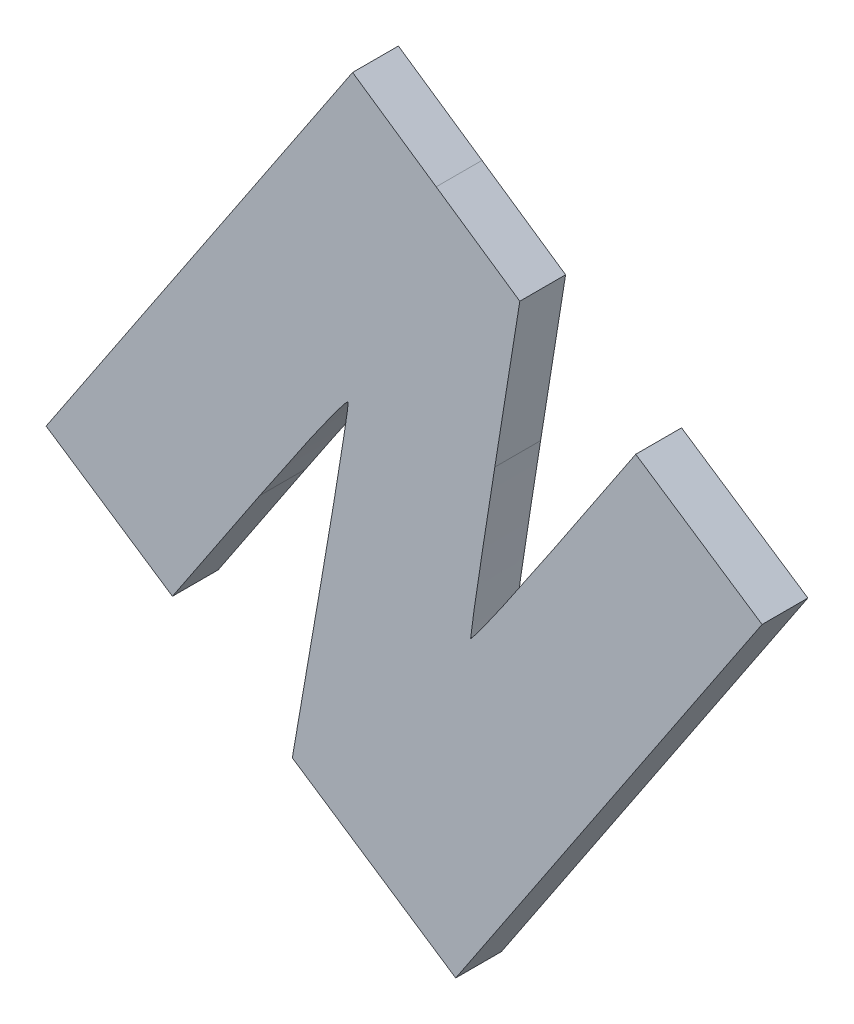
ISO-10303-21;
HEADER;
FILE_DESCRIPTION(('STEP AP214'),'2;1');
FILE_NAME('part.step','',(''),(''),'','','');
FILE_SCHEMA(('AUTOMOTIVE_DESIGN { 1 0 10303 214 1 1 1 1 }'));
ENDSEC;
DATA;
#1=APPLICATION_CONTEXT('core data for automotive mechanical design processes');
#2=APPLICATION_PROTOCOL_DEFINITION('international standard','automotive_design',2000,#1);
#3=PRODUCT_CONTEXT('',#1,'mechanical');
#4=PRODUCT('Part','Part','',(#3));
#5=PRODUCT_RELATED_PRODUCT_CATEGORY('part','',(#4));
#6=PRODUCT_DEFINITION_FORMATION('','',#4);
#7=PRODUCT_DEFINITION_CONTEXT('part definition',#1,'design');
#8=PRODUCT_DEFINITION('design','',#6,#7);
#9=PRODUCT_DEFINITION_SHAPE('','',#8);
#10=(LENGTH_UNIT() NAMED_UNIT(*) SI_UNIT(.MILLI.,.METRE.));
#11=(NAMED_UNIT(*) PLANE_ANGLE_UNIT() SI_UNIT($,.RADIAN.));
#12=(NAMED_UNIT(*) SI_UNIT($,.STERADIAN.) SOLID_ANGLE_UNIT());
#13=UNCERTAINTY_MEASURE_WITH_UNIT(LENGTH_MEASURE(1.E-05),#10,'distance_accuracy_value','');
#14=(GEOMETRIC_REPRESENTATION_CONTEXT(3) GLOBAL_UNCERTAINTY_ASSIGNED_CONTEXT((#13)) GLOBAL_UNIT_ASSIGNED_CONTEXT((#10,
#11,#12)) REPRESENTATION_CONTEXT('',''));
#15=CARTESIAN_POINT('',(0.,0.,0.));
#16=DIRECTION('',(0.,0.,1.));
#17=DIRECTION('',(1.,0.,0.));
#18=AXIS2_PLACEMENT_3D('',#15,#16,#17);
#19=CARTESIAN_POINT('',(-4.12792484346,-1.777454052987,0.));
#20=DIRECTION('',(0.564979802556376,0.825104734384283,0.));
#21=DIRECTION('',(-0.825104734384283,0.564979802556376,0.));
#22=AXIS2_PLACEMENT_3D('',#19,#20,#21);
#23=PLANE('',#22);
#24=DIRECTION('',(0.825104734384283,-0.564979802556376,0.));
#25=VECTOR('',#24,1.);
#26=CARTESIAN_POINT('',(-4.146180366013,-1.764953819868,0.));
#27=LINE('',#26,#25);
#28=CARTESIAN_POINT('',(-4.146180366013,-1.764953819868,0.));
#29=VERTEX_POINT('',#28);
#30=CARTESIAN_POINT('',(-4.12792484346,-1.777454052987,0.));
#31=VERTEX_POINT('',#30);
#32=EDGE_CURVE('E11',#29,#31,#27,.T.);
#33=ORIENTED_EDGE('',*,*,#32,.F.);
#34=DIRECTION('',(0.,0.,1.));
#35=VECTOR('',#34,1.);
#36=CARTESIAN_POINT('',(-4.146180366013,-1.764953819868,0.));
#37=LINE('',#36,#35);
#38=CARTESIAN_POINT('',(-4.146180366013,-1.764953819868,0.01));
#39=VERTEX_POINT('',#38);
#40=EDGE_CURVE('E24',#29,#39,#37,.T.);
#41=ORIENTED_EDGE('',*,*,#40,.T.);
#42=DIRECTION('',(-0.825104734384283,0.564979802556376,0.));
#43=VECTOR('',#42,1.);
#44=CARTESIAN_POINT('',(-4.146180366013,-1.764953819868,0.01));
#45=LINE('',#44,#43);
#46=CARTESIAN_POINT('',(-4.12792484346,-1.777454052987,0.01));
#47=VERTEX_POINT('',#46);
#48=EDGE_CURVE('E142',#47,#39,#45,.T.);
#49=ORIENTED_EDGE('',*,*,#48,.F.);
#50=DIRECTION('',(0.,0.,1.));
#51=VECTOR('',#50,1.);
#52=CARTESIAN_POINT('',(-4.12792484346,-1.777454052987,0.));
#53=LINE('',#52,#51);
#54=EDGE_CURVE('E326',#31,#47,#53,.T.);
#55=ORIENTED_EDGE('',*,*,#54,.F.);
#56=EDGE_LOOP('',(#33,#41,#49,#55));
#57=FACE_BOUND('',#56,.T.);
#58=ADVANCED_FACE('F17',(#57),#23,.T.);
#59=CARTESIAN_POINT('',(-4.109669329617,-1.789954299165,0.));
#60=DIRECTION('',(0.564980387914672,0.82510433356745,0.));
#61=DIRECTION('',(-0.82510433356745,0.564980387914672,0.));
#62=AXIS2_PLACEMENT_3D('',#59,#60,#61);
#63=PLANE('',#62);
#64=DIRECTION('',(0.825104333567451,-0.564980387914672,0.));
#65=VECTOR('',#64,1.);
#66=CARTESIAN_POINT('',(-4.12792484346,-1.777454052987,0.));
#67=LINE('',#66,#65);
#68=CARTESIAN_POINT('',(-4.109669329617,-1.789954299165,0.));
#69=VERTEX_POINT('',#68);
#70=EDGE_CURVE('E324',#31,#69,#67,.T.);
#71=ORIENTED_EDGE('',*,*,#70,.F.);
#72=ORIENTED_EDGE('',*,*,#54,.T.);
#73=DIRECTION('',(-0.825104333567451,0.564980387914672,0.));
#74=VECTOR('',#73,1.);
#75=CARTESIAN_POINT('',(-4.12792484346,-1.777454052987,0.01));
#76=LINE('',#75,#74);
#77=CARTESIAN_POINT('',(-4.109669329617,-1.789954299165,0.01));
#78=VERTEX_POINT('',#77);
#79=EDGE_CURVE('E322',#78,#47,#76,.T.);
#80=ORIENTED_EDGE('',*,*,#79,.F.);
#81=DIRECTION('',(0.,0.,1.));
#82=VECTOR('',#81,1.);
#83=CARTESIAN_POINT('',(-4.109669329617,-1.789954299165,0.));
#84=LINE('',#83,#82);
#85=EDGE_CURVE('E319',#69,#78,#84,.T.);
#86=ORIENTED_EDGE('',*,*,#85,.F.);
#87=EDGE_LOOP('',(#71,#72,#80,#86));
#88=FACE_BOUND('',#87,.T.);
#89=ADVANCED_FACE('F420',(#88),#63,.T.);
#90=CARTESIAN_POINT('',(-4.115127378726,-1.8240489952,0.));
#91=DIRECTION('',(0.987427536095057,-0.158072328259078,0.));
#92=DIRECTION('',(0.158072328259078,0.987427536095057,0.));
#93=AXIS2_PLACEMENT_3D('',#90,#91,#92);
#94=PLANE('',#93);
#95=DIRECTION('',(-0.158072328259078,-0.987427536095057,0.));
#96=VECTOR('',#95,1.);
#97=CARTESIAN_POINT('',(-4.109669329617,-1.789954299165,0.));
#98=LINE('',#97,#96);
#99=CARTESIAN_POINT('',(-4.115127378726,-1.8240489952,0.));
#100=VERTEX_POINT('',#99);
#101=EDGE_CURVE('E317',#69,#100,#98,.T.);
#102=ORIENTED_EDGE('',*,*,#101,.F.);
#103=ORIENTED_EDGE('',*,*,#85,.T.);
#104=DIRECTION('',(0.158072328259078,0.987427536095057,0.));
#105=VECTOR('',#104,1.);
#106=CARTESIAN_POINT('',(-4.109669329617,-1.789954299165,0.01));
#107=LINE('',#106,#105);
#108=CARTESIAN_POINT('',(-4.115127378726,-1.8240489952,0.01));
#109=VERTEX_POINT('',#108);
#110=EDGE_CURVE('E314',#109,#78,#107,.T.);
#111=ORIENTED_EDGE('',*,*,#110,.F.);
#112=DIRECTION('',(0.,0.,1.));
#113=VECTOR('',#112,1.);
#114=CARTESIAN_POINT('',(-4.115127378726,-1.8240489952,0.));
#115=LINE('',#114,#113);
#116=EDGE_CURVE('E311',#100,#109,#115,.T.);
#117=ORIENTED_EDGE('',*,*,#116,.F.);
#118=EDGE_LOOP('',(#102,#103,#111,#117));
#119=FACE_BOUND('',#118,.T.);
#120=ADVANCED_FACE('F424',(#119),#94,.T.);
#121=CARTESIAN_POINT('',(-4.120399596665,-1.859073859283,0.));
#122=CARTESIAN_POINT('',(-4.120399596665,-1.859073859283,0.01));
#123=CARTESIAN_POINT('',(-4.120473713247,-1.85870283569,0.));
#124=CARTESIAN_POINT('',(-4.120473713247,-1.85870283569,0.01));
#125=CARTESIAN_POINT('',(-4.119228420663,-1.850400470958,0.));
#126=CARTESIAN_POINT('',(-4.119228420663,-1.850400470958,0.01));
#127=CARTESIAN_POINT('',(-4.117799330415,-1.840906592343,0.));
#128=CARTESIAN_POINT('',(-4.117799330415,-1.840906592343,0.01));
#129=CARTESIAN_POINT('',(-4.116391214247,-1.831943754932,0.));
#130=CARTESIAN_POINT('',(-4.116391214247,-1.831943754932,0.01));
#131=CARTESIAN_POINT('',(-4.115127378726,-1.8240489952,0.));
#132=CARTESIAN_POINT('',(-4.115127378726,-1.8240489952,0.01));
#133=B_SPLINE_SURFACE_WITH_KNOTS('',3,1,((#121,#122),(#123,#124),(#125,#126),(#127,#128),(#129,
#130),(#131,#132)),.UNSPECIFIED.,.F.,.F.,.F.,(4,2,4),(2,2),(-0.006076537691179,
-0.004797168344129,0.),(0.,0.001),.UNSPECIFIED.);
#134=CARTESIAN_POINT('',(-4.115127378726,-1.8240489952,0.));
#135=CARTESIAN_POINT('',(-4.116391214247,-1.831943754932,0.));
#136=CARTESIAN_POINT('',(-4.117799330415,-1.840906592343,0.));
#137=CARTESIAN_POINT('',(-4.119228420663,-1.850400470958,0.));
#138=CARTESIAN_POINT('',(-4.120473713247,-1.85870283569,0.));
#139=CARTESIAN_POINT('',(-4.120399596665,-1.859073859283,0.));
#140=B_SPLINE_CURVE_WITH_KNOTS('',3,(#134,#135,#136,#137,#138,#139),.UNSPECIFIED.,.F.,.F.,(4,2,
4),(0.,0.004797168344129,0.006076537691179),.UNSPECIFIED.);
#141=CARTESIAN_POINT('',(-4.120399596665,-1.859073859283,0.));
#142=VERTEX_POINT('',#141);
#143=EDGE_CURVE('E302',#100,#142,#140,.T.);
#144=CARTESIAN_POINT('',(-4.120399596665,-1.859073859283,0.01));
#145=CARTESIAN_POINT('',(-4.120473713247,-1.85870283569,0.01));
#146=CARTESIAN_POINT('',(-4.119228420663,-1.850400470958,0.01));
#147=CARTESIAN_POINT('',(-4.117799330415,-1.840906592343,0.01));
#148=CARTESIAN_POINT('',(-4.116391214247,-1.831943754932,0.01));
#149=CARTESIAN_POINT('',(-4.115127378726,-1.8240489952,0.01));
#150=B_SPLINE_CURVE_WITH_KNOTS('',3,(#144,#145,#146,#147,#148,#149),.UNSPECIFIED.,.F.,.F.,(4,2,
4),(-0.006076537691179,-0.004797168344129,0.),.UNSPECIFIED.);
#151=CARTESIAN_POINT('',(-4.120399596665,-1.859073859283,0.01));
#152=VERTEX_POINT('',#151);
#153=EDGE_CURVE('E296',#152,#109,#150,.T.);
#154=CARTESIAN_POINT('',(-4.1203947078425,-1.85908496785932,0.));
#155=CARTESIAN_POINT('',(-4.1203947078425,-1.85908496785932,0.01));
#156=B_SPLINE_CURVE_WITH_KNOTS('',1,(#154,#155),.UNSPECIFIED.,.F.,.F.,(2,2),(0.,0.001),.UNSPECIFIED.);
#157=EDGE_CURVE('E290',#142,#152,#156,.T.);
#158=ORIENTED_EDGE('',*,*,#143,.F.);
#159=ORIENTED_EDGE('',*,*,#116,.T.);
#160=ORIENTED_EDGE('',*,*,#153,.F.);
#161=ORIENTED_EDGE('',*,*,#157,.F.);
#162=EDGE_LOOP('',(#158,#159,#160,#161));
#163=FACE_BOUND('',#162,.T.);
#164=ADVANCED_FACE('F256',(#163),#133,.T.);
#165=CARTESIAN_POINT('',(-4.102283425764,-1.833119402745,0.));
#166=CARTESIAN_POINT('',(-4.102283425764,-1.833119402745,0.01));
#167=CARTESIAN_POINT('',(-4.10970374886,-1.844245406133,0.));
#168=CARTESIAN_POINT('',(-4.10970374886,-1.844245406133,0.01));
#169=CARTESIAN_POINT('',(-4.116169569408,-1.853632561872,0.));
#170=CARTESIAN_POINT('',(-4.116169569408,-1.853632561872,0.01));
#171=CARTESIAN_POINT('',(-4.119335666081,-1.857881451887,0.));
#172=CARTESIAN_POINT('',(-4.119335666081,-1.857881451887,0.01));
#173=CARTESIAN_POINT('',(-4.119909124384,-1.8586383062,0.));
#174=CARTESIAN_POINT('',(-4.119909124384,-1.8586383062,0.01));
#175=CARTESIAN_POINT('',(-4.120246702956,-1.858991440375,0.));
#176=CARTESIAN_POINT('',(-4.120246702956,-1.858991440375,0.01));
#177=CARTESIAN_POINT('',(-4.120296538742,-1.859040676583,0.));
#178=CARTESIAN_POINT('',(-4.120296538742,-1.859040676583,0.01));
#179=CARTESIAN_POINT('',(-4.120345901984,-1.859075683451,0.));
#180=CARTESIAN_POINT('',(-4.120345901984,-1.859075683451,0.01));
#181=CARTESIAN_POINT('',(-4.120357209844,-1.859082720699,0.));
#182=CARTESIAN_POINT('',(-4.120357209844,-1.859082720699,0.01));
#183=CARTESIAN_POINT('',(-4.120371436491,-1.859088263259,0.));
#184=CARTESIAN_POINT('',(-4.120371436491,-1.859088263259,0.01));
#185=CARTESIAN_POINT('',(-4.120375904611,-1.859089599419,0.));
#186=CARTESIAN_POINT('',(-4.120375904611,-1.859089599419,0.01));
#187=CARTESIAN_POINT('',(-4.120382543164,-1.859090146773,0.));
#188=CARTESIAN_POINT('',(-4.120382543164,-1.859090146773,0.01));
#189=CARTESIAN_POINT('',(-4.120384941494,-1.859090056294,0.));
#190=CARTESIAN_POINT('',(-4.120384941494,-1.859090056294,0.01));
#191=CARTESIAN_POINT('',(-4.120389037251,-1.859089021659,0.));
#192=CARTESIAN_POINT('',(-4.120389037251,-1.859089021659,0.01));
#193=CARTESIAN_POINT('',(-4.120390720147,-1.859088272215,0.));
#194=CARTESIAN_POINT('',(-4.120390720147,-1.859088272215,0.01));
#195=CARTESIAN_POINT('',(-4.120393908121,-1.859085979427,0.));
#196=CARTESIAN_POINT('',(-4.120393908121,-1.859085979427,0.01));
#197=CARTESIAN_POINT('',(-4.120395254648,-1.859084452371,0.));
#198=CARTESIAN_POINT('',(-4.120395254648,-1.859084452371,0.01));
#199=CARTESIAN_POINT('',(-4.120397984785,-1.859080041535,0.));
#200=CARTESIAN_POINT('',(-4.120397984785,-1.859080041535,0.01));
#201=CARTESIAN_POINT('',(-4.120399596665,-1.859073859283,0.));
#202=CARTESIAN_POINT('',(-4.120399596665,-1.859073859283,0.01));
#203=B_SPLINE_SURFACE_WITH_KNOTS('',3,1,((#165,#166),(#167,#168),(#169,#170),(#171,#172),(#173,
#174),(#175,#176),(#177,#178),(#179,#180),(#181,#182),(#183,#184),(#185,#186),(#187,#188),(#189,
#190),(#191,#192),(#193,#194),(#195,#196),(#197,#198),(#199,#200),(#201,#202)),.UNSPECIFIED.,
.F.,.F.,.F.,(4,2,2,2,2,2,2,2,1,4),(2,2),(-0.001524783891318,-0.00021860537817736,
-3.95517750286183E-05,-1.48156682566018E-05,-8.22076731637991E-06,-5.6389400794099E-06,
-4.22782943630856E-06,-3.10802930203908E-06,-1.87524287773586E-06,0.),(0.,0.001),.UNSPECIFIED.);
#204=CARTESIAN_POINT('',(-4.102283425764,-1.833119402745,0.));
#205=CARTESIAN_POINT('',(-4.10970374886,-1.844245406133,0.));
#206=CARTESIAN_POINT('',(-4.116169569408,-1.853632561872,0.));
#207=CARTESIAN_POINT('',(-4.119335666081,-1.857881451887,0.));
#208=CARTESIAN_POINT('',(-4.119909124384,-1.8586383062,0.));
#209=CARTESIAN_POINT('',(-4.120246702956,-1.858991440375,0.));
#210=CARTESIAN_POINT('',(-4.120296538742,-1.859040676583,0.));
#211=CARTESIAN_POINT('',(-4.120345901984,-1.859075683451,0.));
#212=CARTESIAN_POINT('',(-4.120357209844,-1.859082720699,0.));
#213=CARTESIAN_POINT('',(-4.120371436491,-1.859088263259,0.));
#214=CARTESIAN_POINT('',(-4.120375904611,-1.859089599419,0.));
#215=CARTESIAN_POINT('',(-4.120382543164,-1.859090146773,0.));
#216=CARTESIAN_POINT('',(-4.120384941494,-1.859090056294,0.));
#217=CARTESIAN_POINT('',(-4.120389037251,-1.859089021659,0.));
#218=CARTESIAN_POINT('',(-4.120390720147,-1.859088272215,0.));
#219=CARTESIAN_POINT('',(-4.120393908121,-1.859085979427,0.));
#220=CARTESIAN_POINT('',(-4.120395254648,-1.859084452371,0.));
#221=CARTESIAN_POINT('',(-4.120397984785,-1.859080041535,0.));
#222=CARTESIAN_POINT('',(-4.120399596665,-1.859073859283,0.));
#223=B_SPLINE_CURVE_WITH_KNOTS('',3,(#204,#205,#206,#207,#208,#209,#210,#211,#212,#213,#214,
#215,#216,#217,#218,#219,#220,#221,#222),.UNSPECIFIED.,.F.,.F.,(4,2,2,2,2,2,2,2,1,4),
(-0.001524783891318,-0.00021860537817736,-3.95517750286183E-05,-1.48156682566018E-05,
-8.22076731637991E-06,-5.6389400794099E-06,-4.22782943630856E-06,-3.10802930203908E-06,
-1.87524287773586E-06,0.),.UNSPECIFIED.);
#224=CARTESIAN_POINT('',(-4.102283425764,-1.833119402745,0.));
#225=VERTEX_POINT('',#224);
#226=EDGE_CURVE('E361',#142,#225,#223,.F.);
#227=CARTESIAN_POINT('',(-4.120399596665,-1.859073859283,0.01));
#228=CARTESIAN_POINT('',(-4.120397984785,-1.859080041535,0.01));
#229=CARTESIAN_POINT('',(-4.120395254648,-1.859084452371,0.01));
#230=CARTESIAN_POINT('',(-4.120393908121,-1.859085979427,0.01));
#231=CARTESIAN_POINT('',(-4.120390720147,-1.859088272215,0.01));
#232=CARTESIAN_POINT('',(-4.120389037251,-1.859089021659,0.01));
#233=CARTESIAN_POINT('',(-4.120384941494,-1.859090056294,0.01));
#234=CARTESIAN_POINT('',(-4.120382543164,-1.859090146773,0.01));
#235=CARTESIAN_POINT('',(-4.120375904611,-1.859089599419,0.01));
#236=CARTESIAN_POINT('',(-4.120371436491,-1.859088263259,0.01));
#237=CARTESIAN_POINT('',(-4.120357209844,-1.859082720699,0.01));
#238=CARTESIAN_POINT('',(-4.120345901984,-1.859075683451,0.01));
#239=CARTESIAN_POINT('',(-4.120296538742,-1.859040676583,0.01));
#240=CARTESIAN_POINT('',(-4.120246702956,-1.858991440375,0.01));
#241=CARTESIAN_POINT('',(-4.119909124384,-1.8586383062,0.01));
#242=CARTESIAN_POINT('',(-4.119335666081,-1.857881451887,0.01));
#243=CARTESIAN_POINT('',(-4.116169569408,-1.853632561872,0.01));
#244=CARTESIAN_POINT('',(-4.10970374886,-1.844245406133,0.01));
#245=CARTESIAN_POINT('',(-4.102283425764,-1.833119402745,0.01));
#246=B_SPLINE_CURVE_WITH_KNOTS('',3,(#227,#228,#229,#230,#231,#232,#233,#234,#235,#236,#237,
#238,#239,#240,#241,#242,#243,#244,#245),.UNSPECIFIED.,.F.,.F.,(4,1,2,2,2,2,2,2,2,4),
(-0.001524783891318,-0.00152290864844026,-0.00152167586201596,-0.00152055606188169,
-0.00151914495123859,-0.00151656312400162,-0.0015099682230614,-0.00148523211628938,
-0.00130617851314064,0.),.UNSPECIFIED.);
#247=CARTESIAN_POINT('',(-4.102283425764,-1.833119402745,0.01));
#248=VERTEX_POINT('',#247);
#249=EDGE_CURVE('E237',#248,#152,#246,.F.);
#250=DIRECTION('',(0.,0.,1.));
#251=VECTOR('',#250,1.);
#252=CARTESIAN_POINT('',(-4.102283425764,-1.833119402745,0.));
#253=LINE('',#252,#251);
#254=EDGE_CURVE('E232',#225,#248,#253,.T.);
#255=ORIENTED_EDGE('',*,*,#226,.F.);
#256=ORIENTED_EDGE('',*,*,#157,.T.);
#257=ORIENTED_EDGE('',*,*,#249,.F.);
#258=ORIENTED_EDGE('',*,*,#254,.F.);
#259=EDGE_LOOP('',(#255,#256,#257,#258));
#260=FACE_BOUND('',#259,.T.);
#261=ADVANCED_FACE('F243',(#260),#203,.T.);
#262=CARTESIAN_POINT('',(-4.084353129571,-1.80623478686,0.));
#263=DIRECTION('',(-0.831947176556516,0.554854841755608,0.));
#264=DIRECTION('',(-0.554854841755608,-0.831947176556516,0.));
#265=AXIS2_PLACEMENT_3D('',#262,#263,#264);
#266=PLANE('',#265);
#267=DIRECTION('',(0.554854841755608,0.831947176556516,0.));
#268=VECTOR('',#267,1.);
#269=CARTESIAN_POINT('',(-4.102283425764,-1.833119402745,0.));
#270=LINE('',#269,#268);
#271=CARTESIAN_POINT('',(-4.084353129571,-1.80623478686,0.));
#272=VERTEX_POINT('',#271);
#273=EDGE_CURVE('E228',#225,#272,#270,.T.);
#274=ORIENTED_EDGE('',*,*,#273,.F.);
#275=ORIENTED_EDGE('',*,*,#254,.T.);
#276=DIRECTION('',(-0.554854841755608,-0.831947176556516,0.));
#277=VECTOR('',#276,1.);
#278=CARTESIAN_POINT('',(-4.102283425764,-1.833119402745,0.01));
#279=LINE('',#278,#277);
#280=CARTESIAN_POINT('',(-4.084353129571,-1.80623478686,0.01));
#281=VERTEX_POINT('',#280);
#282=EDGE_CURVE('E223',#281,#248,#279,.T.);
#283=ORIENTED_EDGE('',*,*,#282,.F.);
#284=DIRECTION('',(0.,0.,1.));
#285=VECTOR('',#284,1.);
#286=CARTESIAN_POINT('',(-4.084353129571,-1.80623478686,0.));
#287=LINE('',#286,#285);
#288=EDGE_CURVE('E220',#272,#281,#287,.T.);
#289=ORIENTED_EDGE('',*,*,#288,.F.);
#290=EDGE_LOOP('',(#274,#275,#283,#289));
#291=FACE_BOUND('',#290,.T.);
#292=ADVANCED_FACE('F255',(#291),#266,.T.);
#293=CARTESIAN_POINT('',(-4.056772012115,-1.824629604455,0.));
#294=DIRECTION('',(0.554854841755512,0.83194717655658,0.));
#295=DIRECTION('',(-0.83194717655658,0.554854841755512,0.));
#296=AXIS2_PLACEMENT_3D('',#293,#294,#295);
#297=PLANE('',#296);
#298=DIRECTION('',(0.83194717655658,-0.554854841755512,0.));
#299=VECTOR('',#298,1.);
#300=CARTESIAN_POINT('',(-4.084353129571,-1.80623478686,0.));
#301=LINE('',#300,#299);
#302=CARTESIAN_POINT('',(-4.056772012115,-1.824629604455,0.));
#303=VERTEX_POINT('',#302);
#304=EDGE_CURVE('E218',#272,#303,#301,.T.);
#305=ORIENTED_EDGE('',*,*,#304,.F.);
#306=ORIENTED_EDGE('',*,*,#288,.T.);
#307=DIRECTION('',(-0.83194717655658,0.554854841755512,0.));
#308=VECTOR('',#307,1.);
#309=CARTESIAN_POINT('',(-4.084353129571,-1.80623478686,0.01));
#310=LINE('',#309,#308);
#311=CARTESIAN_POINT('',(-4.056772012115,-1.824629604455,0.01));
#312=VERTEX_POINT('',#311);
#313=EDGE_CURVE('E215',#312,#281,#310,.T.);
#314=ORIENTED_EDGE('',*,*,#313,.F.);
#315=DIRECTION('',(0.,0.,1.));
#316=VECTOR('',#315,1.);
#317=CARTESIAN_POINT('',(-4.056772012115,-1.824629604455,0.));
#318=LINE('',#317,#316);
#319=EDGE_CURVE('E212',#303,#312,#318,.T.);
#320=ORIENTED_EDGE('',*,*,#319,.F.);
#321=EDGE_LOOP('',(#305,#306,#314,#320));
#322=FACE_BOUND('',#321,.T.);
#323=ADVANCED_FACE('F356',(#322),#297,.T.);
#324=CARTESIAN_POINT('',(-4.123662249206,-1.924924563965,0.));
#325=DIRECTION('',(0.831947176556535,-0.554854841755579,0.));
#326=DIRECTION('',(0.554854841755579,0.831947176556535,0.));
#327=AXIS2_PLACEMENT_3D('',#324,#325,#326);
#328=PLANE('',#327);
#329=DIRECTION('',(-0.554854841755579,-0.831947176556535,0.));
#330=VECTOR('',#329,1.);
#331=CARTESIAN_POINT('',(-4.056772012115,-1.824629604455,0.));
#332=LINE('',#331,#330);
#333=CARTESIAN_POINT('',(-4.123662249206,-1.924924563965,0.));
#334=VERTEX_POINT('',#333);
#335=EDGE_CURVE('E210',#303,#334,#332,.T.);
#336=ORIENTED_EDGE('',*,*,#335,.F.);
#337=ORIENTED_EDGE('',*,*,#319,.T.);
#338=DIRECTION('',(0.554854841755579,0.831947176556535,0.));
#339=VECTOR('',#338,1.);
#340=CARTESIAN_POINT('',(-4.056772012115,-1.824629604455,0.01));
#341=LINE('',#340,#339);
#342=CARTESIAN_POINT('',(-4.123662249206,-1.924924563965,0.01));
#343=VERTEX_POINT('',#342);
#344=EDGE_CURVE('E207',#343,#312,#341,.T.);
#345=ORIENTED_EDGE('',*,*,#344,.F.);
#346=DIRECTION('',(0.,0.,1.));
#347=VECTOR('',#346,1.);
#348=CARTESIAN_POINT('',(-4.123662249206,-1.924924563965,0.));
#349=LINE('',#348,#347);
#350=EDGE_CURVE('E204',#334,#343,#349,.T.);
#351=ORIENTED_EDGE('',*,*,#350,.F.);
#352=EDGE_LOOP('',(#336,#337,#345,#351));
#353=FACE_BOUND('',#352,.T.);
#354=ADVANCED_FACE('F352',(#353),#328,.T.);
#355=CARTESIAN_POINT('',(-4.159336047854,-1.901132452565,0.));
#356=DIRECTION('',(-0.554854841755576,-0.831947176556537,0.));
#357=DIRECTION('',(0.831947176556537,-0.554854841755576,0.));
#358=AXIS2_PLACEMENT_3D('',#355,#356,#357);
#359=PLANE('',#358);
#360=DIRECTION('',(-0.831947176556538,0.554854841755576,0.));
#361=VECTOR('',#360,1.);
#362=CARTESIAN_POINT('',(-4.123662249206,-1.924924563965,0.));
#363=LINE('',#362,#361);
#364=CARTESIAN_POINT('',(-4.159336047854,-1.901132452565,0.));
#365=VERTEX_POINT('',#364);
#366=EDGE_CURVE('E202',#334,#365,#363,.T.);
#367=ORIENTED_EDGE('',*,*,#366,.F.);
#368=ORIENTED_EDGE('',*,*,#350,.T.);
#369=DIRECTION('',(0.831947176556538,-0.554854841755576,0.));
#370=VECTOR('',#369,1.);
#371=CARTESIAN_POINT('',(-4.123662249206,-1.924924563965,0.01));
#372=LINE('',#371,#370);
#373=CARTESIAN_POINT('',(-4.159336047854,-1.901132452565,0.01));
#374=VERTEX_POINT('',#373);
#375=EDGE_CURVE('E199',#374,#343,#372,.T.);
#376=ORIENTED_EDGE('',*,*,#375,.F.);
#377=DIRECTION('',(0.,0.,1.));
#378=VECTOR('',#377,1.);
#379=CARTESIAN_POINT('',(-4.159336047854,-1.901132452565,0.));
#380=LINE('',#379,#378);
#381=EDGE_CURVE('E196',#365,#374,#380,.T.);
#382=ORIENTED_EDGE('',*,*,#381,.F.);
#383=EDGE_LOOP('',(#367,#368,#376,#382));
#384=FACE_BOUND('',#383,.T.);
#385=ADVANCED_FACE('F348',(#384),#359,.T.);
#386=CARTESIAN_POINT('',(-4.153123596152,-1.865124598294,0.));
#387=DIRECTION('',(-0.985440859337493,0.170018565892622,0.));
#388=DIRECTION('',(-0.170018565892622,-0.985440859337493,0.));
#389=AXIS2_PLACEMENT_3D('',#386,#387,#388);
#390=PLANE('',#389);
#391=DIRECTION('',(0.170018565892622,0.985440859337493,0.));
#392=VECTOR('',#391,1.);
#393=CARTESIAN_POINT('',(-4.159336047854,-1.901132452565,0.));
#394=LINE('',#393,#392);
#395=CARTESIAN_POINT('',(-4.153123596152,-1.865124598294,0.));
#396=VERTEX_POINT('',#395);
#397=EDGE_CURVE('E194',#365,#396,#394,.T.);
#398=ORIENTED_EDGE('',*,*,#397,.F.);
#399=ORIENTED_EDGE('',*,*,#381,.T.);
#400=DIRECTION('',(-0.170018565892622,-0.985440859337493,0.));
#401=VECTOR('',#400,1.);
#402=CARTESIAN_POINT('',(-4.159336047854,-1.901132452565,0.01));
#403=LINE('',#402,#401);
#404=CARTESIAN_POINT('',(-4.153123596152,-1.865124598294,0.01));
#405=VERTEX_POINT('',#404);
#406=EDGE_CURVE('E191',#405,#374,#403,.T.);
#407=ORIENTED_EDGE('',*,*,#406,.F.);
#408=DIRECTION('',(0.,0.,1.));
#409=VECTOR('',#408,1.);
#410=CARTESIAN_POINT('',(-4.153123596152,-1.865124598294,0.));
#411=LINE('',#410,#409);
#412=EDGE_CURVE('E185',#396,#405,#411,.T.);
#413=ORIENTED_EDGE('',*,*,#412,.F.);
#414=EDGE_LOOP('',(#398,#399,#407,#413));
#415=FACE_BOUND('',#414,.T.);
#416=ADVANCED_FACE('F344',(#415),#390,.T.);
#417=CARTESIAN_POINT('',(-4.147147268693,-1.827812107416,0.));
#418=CARTESIAN_POINT('',(-4.147147268693,-1.827812107416,0.01));
#419=CARTESIAN_POINT('',(-4.147053095476,-1.828332481853,0.));
#420=CARTESIAN_POINT('',(-4.147053095476,-1.828332481853,0.01));
#421=CARTESIAN_POINT('',(-4.148464267984,-1.837180876166,0.));
#422=CARTESIAN_POINT('',(-4.148464267984,-1.837180876166,0.01));
#423=CARTESIAN_POINT('',(-4.150080445062,-1.847271294303,0.));
#424=CARTESIAN_POINT('',(-4.150080445062,-1.847271294303,0.01));
#425=CARTESIAN_POINT('',(-4.15167929012,-1.856753279044,0.));
#426=CARTESIAN_POINT('',(-4.15167929012,-1.856753279044,0.01));
#427=CARTESIAN_POINT('',(-4.153123596152,-1.865124598294,0.));
#428=CARTESIAN_POINT('',(-4.153123596152,-1.865124598294,0.01));
#429=B_SPLINE_SURFACE_WITH_KNOTS('',3,1,((#417,#418),(#419,#420),(#421,#422),(#423,#424),(#425,
#426),(#427,#428)),.UNSPECIFIED.,.F.,.F.,.F.,(4,2,4),(2,2),(-0.006460773148107,
-0.00509699932583,0.),(0.,0.001),.UNSPECIFIED.);
#430=CARTESIAN_POINT('',(-4.153123596152,-1.865124598294,0.));
#431=CARTESIAN_POINT('',(-4.15167929012,-1.856753279044,0.));
#432=CARTESIAN_POINT('',(-4.150080445062,-1.847271294303,0.));
#433=CARTESIAN_POINT('',(-4.148464267984,-1.837180876166,0.));
#434=CARTESIAN_POINT('',(-4.147053095476,-1.828332481853,0.));
#435=CARTESIAN_POINT('',(-4.147147268693,-1.827812107416,0.));
#436=B_SPLINE_CURVE_WITH_KNOTS('',3,(#430,#431,#432,#433,#434,#435),.UNSPECIFIED.,.F.,.F.,(4,2,
4),(0.,0.00509699932583,0.006460773148107),.UNSPECIFIED.);
#437=CARTESIAN_POINT('',(-4.147147268693,-1.827812107416,0.));
#438=VERTEX_POINT('',#437);
#439=EDGE_CURVE('E178',#396,#438,#436,.T.);
#440=CARTESIAN_POINT('',(-4.147147268693,-1.827812107416,0.01));
#441=CARTESIAN_POINT('',(-4.147053095476,-1.828332481853,0.01));
#442=CARTESIAN_POINT('',(-4.148464267984,-1.837180876166,0.01));
#443=CARTESIAN_POINT('',(-4.150080445062,-1.847271294303,0.01));
#444=CARTESIAN_POINT('',(-4.15167929012,-1.856753279044,0.01));
#445=CARTESIAN_POINT('',(-4.153123596152,-1.865124598294,0.01));
#446=B_SPLINE_CURVE_WITH_KNOTS('',3,(#440,#441,#442,#443,#444,#445),.UNSPECIFIED.,.F.,.F.,(4,2,
4),(-0.006460773148107,-0.00509699932583,0.),.UNSPECIFIED.);
#447=CARTESIAN_POINT('',(-4.147147268693,-1.827812107416,0.01));
#448=VERTEX_POINT('',#447);
#449=EDGE_CURVE('E173',#448,#405,#446,.T.);
#450=DIRECTION('',(0.,0.,1.));
#451=VECTOR('',#450,1.);
#452=CARTESIAN_POINT('',(-4.147147268693,-1.827812107416,0.));
#453=LINE('',#452,#451);
#454=EDGE_CURVE('E167',#438,#448,#453,.T.);
#455=ORIENTED_EDGE('',*,*,#439,.F.);
#456=ORIENTED_EDGE('',*,*,#412,.T.);
#457=ORIENTED_EDGE('',*,*,#449,.F.);
#458=ORIENTED_EDGE('',*,*,#454,.F.);
#459=EDGE_LOOP('',(#455,#456,#457,#458));
#460=FACE_BOUND('',#459,.T.);
#461=ADVANCED_FACE('F340',(#460),#429,.T.);
#462=CARTESIAN_POINT('',(-4.16644709557,-1.855091511872,0.));
#463=CARTESIAN_POINT('',(-4.16644709557,-1.855091511872,0.01));
#464=CARTESIAN_POINT('',(-4.158947113425,-1.843846068019,0.));
#465=CARTESIAN_POINT('',(-4.158947113425,-1.843846068019,0.01));
#466=CARTESIAN_POINT('',(-4.153085916824,-1.835329449471,0.));
#467=CARTESIAN_POINT('',(-4.153085916824,-1.835329449471,0.01));
#468=CARTESIAN_POINT('',(-4.149028753172,-1.829846789003,0.));
#469=CARTESIAN_POINT('',(-4.149028753172,-1.829846789003,0.01));
#470=CARTESIAN_POINT('',(-4.148081799135,-1.828604928545,0.));
#471=CARTESIAN_POINT('',(-4.148081799135,-1.828604928545,0.01));
#472=CARTESIAN_POINT('',(-4.147469942063,-1.827969850306,0.));
#473=CARTESIAN_POINT('',(-4.147469942063,-1.827969850306,0.01));
#474=CARTESIAN_POINT('',(-4.147369856975,-1.827872248164,0.));
#475=CARTESIAN_POINT('',(-4.147369856975,-1.827872248164,0.01));
#476=CARTESIAN_POINT('',(-4.147267374364,-1.827801014472,0.));
#477=CARTESIAN_POINT('',(-4.147267374364,-1.827801014472,0.01));
#478=CARTESIAN_POINT('',(-4.147243157055,-1.827786354916,0.));
#479=CARTESIAN_POINT('',(-4.147243157055,-1.827786354916,0.01));
#480=CARTESIAN_POINT('',(-4.147212103164,-1.827774743759,0.));
#481=CARTESIAN_POINT('',(-4.147212103164,-1.827774743759,0.01));
#482=CARTESIAN_POINT('',(-4.147202171347,-1.827771955763,0.));
#483=CARTESIAN_POINT('',(-4.147202171347,-1.827771955763,0.01));
#484=CARTESIAN_POINT('',(-4.147187196833,-1.827770981911,0.));
#485=CARTESIAN_POINT('',(-4.147187196833,-1.827770981911,0.01));
#486=CARTESIAN_POINT('',(-4.147181708916,-1.82777130544,0.));
#487=CARTESIAN_POINT('',(-4.147181708916,-1.82777130544,0.01));
#488=CARTESIAN_POINT('',(-4.147172191377,-1.827773923586,0.));
#489=CARTESIAN_POINT('',(-4.147172191377,-1.827773923586,0.01));
#490=CARTESIAN_POINT('',(-4.147168236413,-1.827775813588,0.));
#491=CARTESIAN_POINT('',(-4.147168236413,-1.827775813588,0.01));
#492=CARTESIAN_POINT('',(-4.14716068665,-1.827781546485,0.));
#493=CARTESIAN_POINT('',(-4.14716068665,-1.827781546485,0.01));
#494=CARTESIAN_POINT('',(-4.14715750024,-1.827785382375,0.));
#495=CARTESIAN_POINT('',(-4.14715750024,-1.827785382375,0.01));
#496=CARTESIAN_POINT('',(-4.147151000756,-1.827796485817,0.));
#497=CARTESIAN_POINT('',(-4.147151000756,-1.827796485817,0.01));
#498=CARTESIAN_POINT('',(-4.147148662888,-1.827804403671,0.));
#499=CARTESIAN_POINT('',(-4.147148662888,-1.827804403671,0.01));
#500=CARTESIAN_POINT('',(-4.147147268693,-1.827812107416,0.));
#501=CARTESIAN_POINT('',(-4.147147268693,-1.827812107416,0.01));
#502=B_SPLINE_SURFACE_WITH_KNOTS('',3,1,((#462,#463),(#464,#465),(#466,#467),(#468,#469),(#470,
#471),(#472,#473),(#474,#475),(#476,#477),(#478,#479),(#480,#481),(#482,#483),(#484,#485),(#486,
#487),(#488,#489),(#490,#491),(#492,#493),(#494,#495),(#496,#497),(#498,#499),(#500,#501)),
.UNSPECIFIED.,.F.,.F.,.F.,(4,2,2,2,2,2,2,2,2,4),(2,2),(-0.001687945151974,-0.000406048712198667,
-8.42798597844761E-05,-3.35324954752528E-05,-1.93673253947439E-05,-1.36192147967533E-05,
-1.03752116903804E-05,-7.70688191909238E-06,-4.69733188748354E-06,0.),(0.,0.001),.UNSPECIFIED.);
#503=CARTESIAN_POINT('',(-4.147147268693,-1.827812107416,0.));
#504=CARTESIAN_POINT('',(-4.147148662888,-1.827804403671,0.));
#505=CARTESIAN_POINT('',(-4.147151000756,-1.827796485817,0.));
#506=CARTESIAN_POINT('',(-4.14715750024,-1.827785382375,0.));
#507=CARTESIAN_POINT('',(-4.14716068665,-1.827781546485,0.));
#508=CARTESIAN_POINT('',(-4.147168236413,-1.827775813588,0.));
#509=CARTESIAN_POINT('',(-4.147172191377,-1.827773923586,0.));
#510=CARTESIAN_POINT('',(-4.147181708916,-1.82777130544,0.));
#511=CARTESIAN_POINT('',(-4.147187196833,-1.827770981911,0.));
#512=CARTESIAN_POINT('',(-4.147202171347,-1.827771955763,0.));
#513=CARTESIAN_POINT('',(-4.147212103164,-1.827774743759,0.));
#514=CARTESIAN_POINT('',(-4.147243157055,-1.827786354916,0.));
#515=CARTESIAN_POINT('',(-4.147267374364,-1.827801014472,0.));
#516=CARTESIAN_POINT('',(-4.147369856975,-1.827872248164,0.));
#517=CARTESIAN_POINT('',(-4.147469942063,-1.827969850306,0.));
#518=CARTESIAN_POINT('',(-4.148081799135,-1.828604928545,0.));
#519=CARTESIAN_POINT('',(-4.149028753172,-1.829846789003,0.));
#520=CARTESIAN_POINT('',(-4.153085916824,-1.835329449471,0.));
#521=CARTESIAN_POINT('',(-4.158947113425,-1.843846068019,0.));
#522=CARTESIAN_POINT('',(-4.16644709557,-1.855091511872,0.));
#523=B_SPLINE_CURVE_WITH_KNOTS('',3,(#503,#504,#505,#506,#507,#508,#509,#510,#511,#512,#513,
#514,#515,#516,#517,#518,#519,#520,#521,#522),.UNSPECIFIED.,.F.,.F.,(4,2,2,2,2,2,2,2,2,4),(0.,
4.69733188748354E-06,7.70688191909238E-06,1.03752116903804E-05,1.36192147967533E-05,
1.93673253947439E-05,3.35324954752528E-05,8.42798597844761E-05,0.000406048712198667,
0.001687945151974),.UNSPECIFIED.);
#524=CARTESIAN_POINT('',(-4.16644709557,-1.855091511872,0.));
#525=VERTEX_POINT('',#524);
#526=EDGE_CURVE('E160',#438,#525,#523,.T.);
#527=CARTESIAN_POINT('',(-4.16644709557,-1.855091511872,0.01));
#528=CARTESIAN_POINT('',(-4.158947113425,-1.843846068019,0.01));
#529=CARTESIAN_POINT('',(-4.153085916824,-1.835329449471,0.01));
#530=CARTESIAN_POINT('',(-4.149028753172,-1.829846789003,0.01));
#531=CARTESIAN_POINT('',(-4.148081799135,-1.828604928545,0.01));
#532=CARTESIAN_POINT('',(-4.147469942063,-1.827969850306,0.01));
#533=CARTESIAN_POINT('',(-4.147369856975,-1.827872248164,0.01));
#534=CARTESIAN_POINT('',(-4.147267374364,-1.827801014472,0.01));
#535=CARTESIAN_POINT('',(-4.147243157055,-1.827786354916,0.01));
#536=CARTESIAN_POINT('',(-4.147212103164,-1.827774743759,0.01));
#537=CARTESIAN_POINT('',(-4.147202171347,-1.827771955763,0.01));
#538=CARTESIAN_POINT('',(-4.147187196833,-1.827770981911,0.01));
#539=CARTESIAN_POINT('',(-4.147181708916,-1.82777130544,0.01));
#540=CARTESIAN_POINT('',(-4.147172191377,-1.827773923586,0.01));
#541=CARTESIAN_POINT('',(-4.147168236413,-1.827775813588,0.01));
#542=CARTESIAN_POINT('',(-4.14716068665,-1.827781546485,0.01));
#543=CARTESIAN_POINT('',(-4.14715750024,-1.827785382375,0.01));
#544=CARTESIAN_POINT('',(-4.147151000756,-1.827796485817,0.01));
#545=CARTESIAN_POINT('',(-4.147148662888,-1.827804403671,0.01));
#546=CARTESIAN_POINT('',(-4.147147268693,-1.827812107416,0.01));
#547=B_SPLINE_CURVE_WITH_KNOTS('',3,(#527,#528,#529,#530,#531,#532,#533,#534,#535,#536,#537,
#538,#539,#540,#541,#542,#543,#544,#545,#546),.UNSPECIFIED.,.F.,.F.,(4,2,2,2,2,2,2,2,2,4),
(-0.001687945151974,-0.000406048712198667,-8.42798597844761E-05,-3.35324954752528E-05,
-1.93673253947439E-05,-1.36192147967533E-05,-1.03752116903804E-05,-7.70688191909238E-06,
-4.69733188748354E-06,0.),.UNSPECIFIED.);
#548=CARTESIAN_POINT('',(-4.16644709557,-1.855091511872,0.01));
#549=VERTEX_POINT('',#548);
#550=EDGE_CURVE('E155',#549,#448,#547,.T.);
#551=DIRECTION('',(0.,0.,1.));
#552=VECTOR('',#551,1.);
#553=CARTESIAN_POINT('',(-4.16644709557,-1.855091511872,0.));
#554=LINE('',#553,#552);
#555=EDGE_CURVE('E152',#525,#549,#554,.T.);
#556=ORIENTED_EDGE('',*,*,#526,.F.);
#557=ORIENTED_EDGE('',*,*,#454,.T.);
#558=ORIENTED_EDGE('',*,*,#550,.F.);
#559=ORIENTED_EDGE('',*,*,#555,.F.);
#560=EDGE_LOOP('',(#556,#557,#558,#559));
#561=FACE_BOUND('',#560,.T.);
#562=ADVANCED_FACE('F336',(#561),#502,.T.);
#563=CARTESIAN_POINT('',(-4.185510815623,-1.883675579054,0.));
#564=DIRECTION('',(0.831947176556586,-0.554854841755504,0.));
#565=DIRECTION('',(0.554854841755504,0.831947176556586,0.));
#566=AXIS2_PLACEMENT_3D('',#563,#564,#565);
#567=PLANE('',#566);
#568=DIRECTION('',(-0.554854841755504,-0.831947176556586,0.));
#569=VECTOR('',#568,1.);
#570=CARTESIAN_POINT('',(-4.16644709557,-1.855091511872,0.));
#571=LINE('',#570,#569);
#572=CARTESIAN_POINT('',(-4.185510815623,-1.883675579054,0.));
#573=VERTEX_POINT('',#572);
#574=EDGE_CURVE('E150',#525,#573,#571,.T.);
#575=ORIENTED_EDGE('',*,*,#574,.F.);
#576=ORIENTED_EDGE('',*,*,#555,.T.);
#577=DIRECTION('',(0.554854841755504,0.831947176556586,0.));
#578=VECTOR('',#577,1.);
#579=CARTESIAN_POINT('',(-4.16644709557,-1.855091511872,0.01));
#580=LINE('',#579,#578);
#581=CARTESIAN_POINT('',(-4.185510815623,-1.883675579054,0.01));
#582=VERTEX_POINT('',#581);
#583=EDGE_CURVE('E148',#582,#549,#580,.T.);
#584=ORIENTED_EDGE('',*,*,#583,.F.);
#585=DIRECTION('',(0.,0.,1.));
#586=VECTOR('',#585,1.);
#587=CARTESIAN_POINT('',(-4.185510815623,-1.883675579054,0.));
#588=LINE('',#587,#586);
#589=EDGE_CURVE('E127',#573,#582,#588,.T.);
#590=ORIENTED_EDGE('',*,*,#589,.F.);
#591=EDGE_LOOP('',(#575,#576,#584,#590));
#592=FACE_BOUND('',#591,.T.);
#593=ADVANCED_FACE('F334',(#592),#567,.T.);
#594=CARTESIAN_POINT('',(-4.21309193308,-1.865280761459,0.));
#595=DIRECTION('',(-0.55485484175556,-0.831947176556548,0.));
#596=DIRECTION('',(0.831947176556548,-0.55485484175556,0.));
#597=AXIS2_PLACEMENT_3D('',#594,#595,#596);
#598=PLANE('',#597);
#599=DIRECTION('',(-0.831947176556548,0.55485484175556,0.));
#600=VECTOR('',#599,1.);
#601=CARTESIAN_POINT('',(-4.185510815623,-1.883675579054,0.));
#602=LINE('',#601,#600);
#603=CARTESIAN_POINT('',(-4.21309193308,-1.865280761459,0.));
#604=VERTEX_POINT('',#603);
#605=EDGE_CURVE('E131',#573,#604,#602,.T.);
#606=ORIENTED_EDGE('',*,*,#605,.F.);
#607=ORIENTED_EDGE('',*,*,#589,.T.);
#608=DIRECTION('',(0.831947176556548,-0.55485484175556,0.));
#609=VECTOR('',#608,1.);
#610=CARTESIAN_POINT('',(-4.185510815623,-1.883675579054,0.01));
#611=LINE('',#610,#609);
#612=CARTESIAN_POINT('',(-4.21309193308,-1.865280761459,0.01));
#613=VERTEX_POINT('',#612);
#614=EDGE_CURVE('E120',#613,#582,#611,.T.);
#615=ORIENTED_EDGE('',*,*,#614,.F.);
#616=DIRECTION('',(0.,0.,1.));
#617=VECTOR('',#616,1.);
#618=CARTESIAN_POINT('',(-4.21309193308,-1.865280761459,0.));
#619=LINE('',#618,#617);
#620=EDGE_CURVE('E124',#604,#613,#619,.T.);
#621=ORIENTED_EDGE('',*,*,#620,.F.);
#622=EDGE_LOOP('',(#606,#607,#615,#621));
#623=FACE_BOUND('',#622,.T.);
#624=ADVANCED_FACE('F123',(#623),#598,.T.);
#625=CARTESIAN_POINT('',(-4.146180366013,-1.764953819868,0.));
#626=DIRECTION('',(-0.831947176556528,0.55485484175559,0.));
#627=DIRECTION('',(-0.55485484175559,-0.831947176556529,0.));
#628=AXIS2_PLACEMENT_3D('',#625,#626,#627);
#629=PLANE('',#628);
#630=DIRECTION('',(0.55485484175559,0.831947176556528,0.));
#631=VECTOR('',#630,1.);
#632=CARTESIAN_POINT('',(-4.179636149546,-1.815117290663,0.));
#633=LINE('',#632,#631);
#634=EDGE_CURVE('E137',#604,#29,#633,.T.);
#635=ORIENTED_EDGE('',*,*,#634,.F.);
#636=ORIENTED_EDGE('',*,*,#620,.T.);
#637=DIRECTION('',(-0.55485484175559,-0.831947176556528,0.));
#638=VECTOR('',#637,1.);
#639=CARTESIAN_POINT('',(-4.179636149546,-1.815117290663,0.01));
#640=LINE('',#639,#638);
#641=EDGE_CURVE('E136',#39,#613,#640,.T.);
#642=ORIENTED_EDGE('',*,*,#641,.F.);
#643=ORIENTED_EDGE('',*,*,#40,.F.);
#644=EDGE_LOOP('',(#635,#636,#642,#643));
#645=FACE_BOUND('',#644,.T.);
#646=ADVANCED_FACE('F135',(#645),#629,.T.);
#647=CARTESIAN_POINT('',(-4.134935250165,-1.844838080134,0.));
#648=DIRECTION('',(0.,0.,1.));
#649=DIRECTION('',(1.,0.,0.));
#650=AXIS2_PLACEMENT_3D('',#647,#648,#649);
#651=PLANE('',#650);
#652=ORIENTED_EDGE('',*,*,#634,.T.);
#653=ORIENTED_EDGE('',*,*,#32,.T.);
#654=ORIENTED_EDGE('',*,*,#70,.T.);
#655=ORIENTED_EDGE('',*,*,#101,.T.);
#656=ORIENTED_EDGE('',*,*,#143,.T.);
#657=ORIENTED_EDGE('',*,*,#226,.T.);
#658=ORIENTED_EDGE('',*,*,#273,.T.);
#659=ORIENTED_EDGE('',*,*,#304,.T.);
#660=ORIENTED_EDGE('',*,*,#335,.T.);
#661=ORIENTED_EDGE('',*,*,#366,.T.);
#662=ORIENTED_EDGE('',*,*,#397,.T.);
#663=ORIENTED_EDGE('',*,*,#439,.T.);
#664=ORIENTED_EDGE('',*,*,#526,.T.);
#665=ORIENTED_EDGE('',*,*,#574,.T.);
#666=ORIENTED_EDGE('',*,*,#605,.T.);
#667=EDGE_LOOP('',(#652,#653,#654,#655,#656,#657,#658,#659,#660,#661,#662,#663,#664,#665,#666));
#668=FACE_BOUND('',#667,.T.);
#669=ADVANCED_FACE('F329',(#668),#651,.F.);
#670=CARTESIAN_POINT('',(-4.134935250165,-1.844838080134,0.01));
#671=DIRECTION('',(0.,0.,1.));
#672=DIRECTION('',(1.,0.,0.));
#673=AXIS2_PLACEMENT_3D('',#670,#671,#672);
#674=PLANE('',#673);
#675=ORIENTED_EDGE('',*,*,#641,.T.);
#676=ORIENTED_EDGE('',*,*,#614,.T.);
#677=ORIENTED_EDGE('',*,*,#583,.T.);
#678=ORIENTED_EDGE('',*,*,#550,.T.);
#679=ORIENTED_EDGE('',*,*,#449,.T.);
#680=ORIENTED_EDGE('',*,*,#406,.T.);
#681=ORIENTED_EDGE('',*,*,#375,.T.);
#682=ORIENTED_EDGE('',*,*,#344,.T.);
#683=ORIENTED_EDGE('',*,*,#313,.T.);
#684=ORIENTED_EDGE('',*,*,#282,.T.);
#685=ORIENTED_EDGE('',*,*,#249,.T.);
#686=ORIENTED_EDGE('',*,*,#153,.T.);
#687=ORIENTED_EDGE('',*,*,#110,.T.);
#688=ORIENTED_EDGE('',*,*,#79,.T.);
#689=ORIENTED_EDGE('',*,*,#48,.T.);
#690=EDGE_LOOP('',(#675,#676,#677,#678,#679,#680,#681,#682,#683,#684,#685,#686,#687,#688,#689));
#691=FACE_BOUND('',#690,.T.);
#692=ADVANCED_FACE('F140',(#691),#674,.T.);
#693=CLOSED_SHELL('',(#58,#89,#120,#164,#261,#292,#323,#354,#385,#416,#461,#562,#593,#624,#646,
#669,#692));
#694=MANIFOLD_SOLID_BREP('B1',#693);
#695=ADVANCED_BREP_SHAPE_REPRESENTATION('',(#18,#694),#14);
#696=SHAPE_DEFINITION_REPRESENTATION(#9,#695);
ENDSEC;
END-ISO-10303-21;
